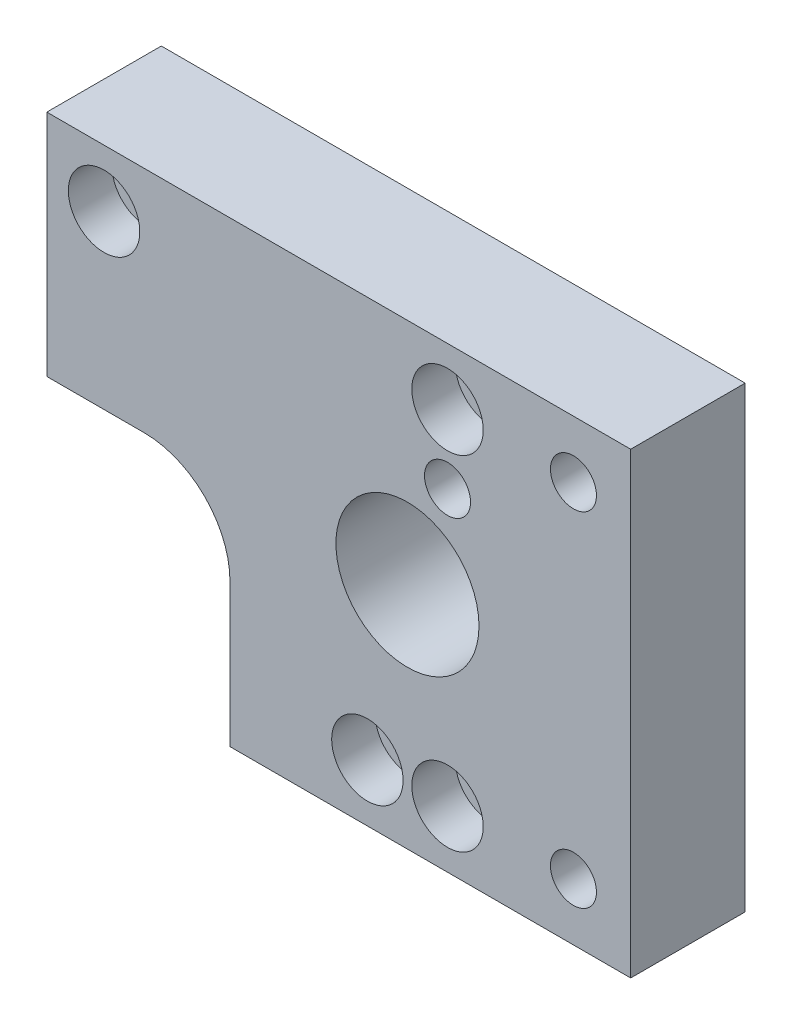
ISO-10303-21;
HEADER;
FILE_DESCRIPTION(('STEP AP214'),'2;1');
FILE_NAME('part.step','',(''),(''),'','','');
FILE_SCHEMA(('AUTOMOTIVE_DESIGN { 1 0 10303 214 1 1 1 1 }'));
ENDSEC;
DATA;
#1=APPLICATION_CONTEXT('core data for automotive mechanical design processes');
#2=APPLICATION_PROTOCOL_DEFINITION('international standard','automotive_design',2000,#1);
#3=PRODUCT_CONTEXT('',#1,'mechanical');
#4=PRODUCT('Part','Part','',(#3));
#5=PRODUCT_RELATED_PRODUCT_CATEGORY('part','',(#4));
#6=PRODUCT_DEFINITION_FORMATION('','',#4);
#7=PRODUCT_DEFINITION_CONTEXT('part definition',#1,'design');
#8=PRODUCT_DEFINITION('design','',#6,#7);
#9=PRODUCT_DEFINITION_SHAPE('','',#8);
#10=(LENGTH_UNIT() NAMED_UNIT(*) SI_UNIT(.MILLI.,.METRE.));
#11=(NAMED_UNIT(*) PLANE_ANGLE_UNIT() SI_UNIT($,.RADIAN.));
#12=(NAMED_UNIT(*) SI_UNIT($,.STERADIAN.) SOLID_ANGLE_UNIT());
#13=UNCERTAINTY_MEASURE_WITH_UNIT(LENGTH_MEASURE(1.E-05),#10,'distance_accuracy_value','');
#14=(GEOMETRIC_REPRESENTATION_CONTEXT(3) GLOBAL_UNCERTAINTY_ASSIGNED_CONTEXT((#13)) GLOBAL_UNIT_ASSIGNED_CONTEXT((#10,
#11,#12)) REPRESENTATION_CONTEXT('',''));
#15=CARTESIAN_POINT('',(0.,0.,0.));
#16=DIRECTION('',(0.,0.,1.));
#17=DIRECTION('',(1.,0.,0.));
#18=AXIS2_PLACEMENT_3D('',#15,#16,#17);
#19=CARTESIAN_POINT('',(0.,0.,12.7));
#20=DIRECTION('',(0.,0.,-1.));
#21=DIRECTION('',(-1.,0.,0.));
#22=AXIS2_PLACEMENT_3D('',#19,#20,#21);
#23=PLANE('',#22);
#24=CARTESIAN_POINT('',(19.05,-19.05,12.7));
#25=DIRECTION('',(0.,0.,-1.));
#26=DIRECTION('',(-1.,0.,0.));
#27=AXIS2_PLACEMENT_3D('',#24,#25,#26);
#28=CIRCLE('',#27,3.9624);
#29=CARTESIAN_POINT('',(15.0876,-19.05,12.7));
#30=VERTEX_POINT('',#29);
#31=EDGE_CURVE('E155',#30,#30,#28,.T.);
#32=ORIENTED_EDGE('',*,*,#31,.T.);
#33=EDGE_LOOP('',(#32));
#34=FACE_BOUND('',#33,.T.);
#35=CARTESIAN_POINT('',(19.05,19.05,12.7));
#36=DIRECTION('',(0.,0.,-1.));
#37=DIRECTION('',(-1.,0.,0.));
#38=AXIS2_PLACEMENT_3D('',#35,#36,#37);
#39=CIRCLE('',#38,3.9624);
#40=CARTESIAN_POINT('',(15.0876,19.05,12.7));
#41=VERTEX_POINT('',#40);
#42=EDGE_CURVE('E145',#41,#41,#39,.T.);
#43=ORIENTED_EDGE('',*,*,#42,.T.);
#44=EDGE_LOOP('',(#43));
#45=FACE_BOUND('',#44,.T.);
#46=CARTESIAN_POINT('',(33.02,-19.05,12.7));
#47=DIRECTION('',(0.,0.,-1.));
#48=DIRECTION('',(-1.,0.,0.));
#49=AXIS2_PLACEMENT_3D('',#46,#47,#48);
#50=CIRCLE('',#49,2.55269999999999);
#51=CARTESIAN_POINT('',(30.4673,-19.05,12.7));
#52=VERTEX_POINT('',#51);
#53=EDGE_CURVE('E195',#52,#52,#50,.T.);
#54=ORIENTED_EDGE('',*,*,#53,.T.);
#55=EDGE_LOOP('',(#54));
#56=FACE_BOUND('',#55,.T.);
#57=CARTESIAN_POINT('',(33.02,19.05,12.7));
#58=DIRECTION('',(0.,0.,-1.));
#59=DIRECTION('',(-1.,0.,0.));
#60=AXIS2_PLACEMENT_3D('',#57,#58,#59);
#61=CIRCLE('',#60,2.55269999999999);
#62=CARTESIAN_POINT('',(30.4673,19.05,12.7));
#63=VERTEX_POINT('',#62);
#64=EDGE_CURVE('E201',#63,#63,#61,.T.);
#65=ORIENTED_EDGE('',*,*,#64,.T.);
#66=EDGE_LOOP('',(#65));
#67=FACE_BOUND('',#66,.T.);
#68=CARTESIAN_POINT('',(19.05,11.43,12.7));
#69=DIRECTION('',(0.,0.,-1.));
#70=DIRECTION('',(-1.,0.,0.));
#71=AXIS2_PLACEMENT_3D('',#68,#69,#70);
#72=CIRCLE('',#71,2.55269999999999);
#73=CARTESIAN_POINT('',(16.4973,11.43,12.7));
#74=VERTEX_POINT('',#73);
#75=EDGE_CURVE('E207',#74,#74,#72,.T.);
#76=ORIENTED_EDGE('',*,*,#75,.T.);
#77=EDGE_LOOP('',(#76));
#78=FACE_BOUND('',#77,.T.);
#79=DIRECTION('',(1.,0.,0.));
#80=VECTOR('',#79,1.);
#81=CARTESIAN_POINT('',(-25.4,0.,12.7));
#82=LINE('',#81,#80);
#83=CARTESIAN_POINT('',(-25.4,0.,12.7));
#84=VERTEX_POINT('',#83);
#85=CARTESIAN_POINT('',(-14.605,0.,12.7));
#86=VERTEX_POINT('',#85);
#87=EDGE_CURVE('E88',#84,#86,#82,.T.);
#88=ORIENTED_EDGE('',*,*,#87,.T.);
#89=CARTESIAN_POINT('',(-14.605,-9.525,12.7));
#90=DIRECTION('',(0.,0.,-1.));
#91=DIRECTION('',(-1.,0.,0.));
#92=AXIS2_PLACEMENT_3D('',#89,#90,#91);
#93=CIRCLE('',#92,9.525);
#94=CARTESIAN_POINT('',(-5.08,-9.525,12.7));
#95=VERTEX_POINT('',#94);
#96=EDGE_CURVE('E11',#86,#95,#93,.T.);
#97=ORIENTED_EDGE('',*,*,#96,.T.);
#98=DIRECTION('',(0.,-1.,0.));
#99=VECTOR('',#98,1.);
#100=CARTESIAN_POINT('',(-5.08,-25.4,12.7));
#101=LINE('',#100,#99);
#102=CARTESIAN_POINT('',(-5.08,-25.4,12.7));
#103=VERTEX_POINT('',#102);
#104=EDGE_CURVE('E95',#95,#103,#101,.T.);
#105=ORIENTED_EDGE('',*,*,#104,.T.);
#106=DIRECTION('',(1.,0.,0.));
#107=VECTOR('',#106,1.);
#108=CARTESIAN_POINT('',(-25.4,-25.4,12.7));
#109=LINE('',#108,#107);
#110=CARTESIAN_POINT('',(39.37,-25.4,12.7));
#111=VERTEX_POINT('',#110);
#112=EDGE_CURVE('E112',#103,#111,#109,.T.);
#113=ORIENTED_EDGE('',*,*,#112,.T.);
#114=DIRECTION('',(0.,1.,0.));
#115=VECTOR('',#114,1.);
#116=CARTESIAN_POINT('',(39.37,-25.4,12.7));
#117=LINE('',#116,#115);
#118=CARTESIAN_POINT('',(39.37,25.4,12.7));
#119=VERTEX_POINT('',#118);
#120=EDGE_CURVE('E116',#111,#119,#117,.T.);
#121=ORIENTED_EDGE('',*,*,#120,.T.);
#122=DIRECTION('',(-1.,0.,0.));
#123=VECTOR('',#122,1.);
#124=CARTESIAN_POINT('',(-25.4,25.4,12.7));
#125=LINE('',#124,#123);
#126=CARTESIAN_POINT('',(-25.4,25.4,12.7));
#127=VERTEX_POINT('',#126);
#128=EDGE_CURVE('E110',#119,#127,#125,.T.);
#129=ORIENTED_EDGE('',*,*,#128,.T.);
#130=DIRECTION('',(0.,-1.,0.));
#131=VECTOR('',#130,1.);
#132=CARTESIAN_POINT('',(-25.4,-25.4,12.7));
#133=LINE('',#132,#131);
#134=EDGE_CURVE('E103',#127,#84,#133,.T.);
#135=ORIENTED_EDGE('',*,*,#134,.T.);
#136=EDGE_LOOP('',(#88,#97,#105,#113,#121,#129,#135));
#137=FACE_BOUND('',#136,.T.);
#138=CARTESIAN_POINT('',(14.605,0.,12.7));
#139=DIRECTION('',(0.,0.,1.));
#140=DIRECTION('',(1.,0.,0.));
#141=AXIS2_PLACEMENT_3D('',#138,#139,#140);
#142=CIRCLE('',#141,7.9375);
#143=CARTESIAN_POINT('',(22.5425,0.,12.7));
#144=VERTEX_POINT('',#143);
#145=EDGE_CURVE('E211',#144,#144,#142,.T.);
#146=ORIENTED_EDGE('',*,*,#145,.F.);
#147=EDGE_LOOP('',(#146));
#148=FACE_BOUND('',#147,.T.);
#149=CARTESIAN_POINT('',(10.16,-19.05,12.7));
#150=DIRECTION('',(0.,0.,-1.));
#151=DIRECTION('',(-1.,0.,0.));
#152=AXIS2_PLACEMENT_3D('',#149,#150,#151);
#153=CIRCLE('',#152,3.9624);
#154=CARTESIAN_POINT('',(6.1976,-19.05,12.7));
#155=VERTEX_POINT('',#154);
#156=EDGE_CURVE('E150',#155,#155,#153,.T.);
#157=ORIENTED_EDGE('',*,*,#156,.T.);
#158=EDGE_LOOP('',(#157));
#159=FACE_BOUND('',#158,.T.);
#160=CARTESIAN_POINT('',(-19.05,19.05,12.7));
#161=DIRECTION('',(0.,0.,-1.));
#162=DIRECTION('',(-1.,0.,0.));
#163=AXIS2_PLACEMENT_3D('',#160,#161,#162);
#164=CIRCLE('',#163,3.9624);
#165=CARTESIAN_POINT('',(-23.0124,19.05,12.7));
#166=VERTEX_POINT('',#165);
#167=EDGE_CURVE('E175',#166,#166,#164,.T.);
#168=ORIENTED_EDGE('',*,*,#167,.T.);
#169=EDGE_LOOP('',(#168));
#170=FACE_BOUND('',#169,.T.);
#171=ADVANCED_FACE('F33',(#34,#45,#56,#67,#78,#137,#148,#159,#170),#23,.F.);
#172=CARTESIAN_POINT('',(0.,0.,0.));
#173=DIRECTION('',(0.,0.,-1.));
#174=DIRECTION('',(-1.,0.,0.));
#175=AXIS2_PLACEMENT_3D('',#172,#173,#174);
#176=PLANE('',#175);
#177=DIRECTION('',(0.,-1.,0.));
#178=VECTOR('',#177,1.);
#179=CARTESIAN_POINT('',(-5.08,-25.4,0.));
#180=LINE('',#179,#178);
#181=CARTESIAN_POINT('',(-5.08,-9.525,0.));
#182=VERTEX_POINT('',#181);
#183=CARTESIAN_POINT('',(-5.08,-25.4,0.));
#184=VERTEX_POINT('',#183);
#185=EDGE_CURVE('E96',#182,#184,#180,.T.);
#186=ORIENTED_EDGE('',*,*,#185,.F.);
#187=CARTESIAN_POINT('',(-14.605,-9.525,0.));
#188=DIRECTION('',(0.,0.,-1.));
#189=DIRECTION('',(-1.,0.,0.));
#190=AXIS2_PLACEMENT_3D('',#187,#188,#189);
#191=CIRCLE('',#190,9.525);
#192=CARTESIAN_POINT('',(-14.605,0.,0.));
#193=VERTEX_POINT('',#192);
#194=EDGE_CURVE('E41',#182,#193,#191,.F.);
#195=ORIENTED_EDGE('',*,*,#194,.T.);
#196=DIRECTION('',(1.,0.,0.));
#197=VECTOR('',#196,1.);
#198=CARTESIAN_POINT('',(-25.4,0.,0.));
#199=LINE('',#198,#197);
#200=CARTESIAN_POINT('',(-25.4,0.,0.));
#201=VERTEX_POINT('',#200);
#202=EDGE_CURVE('E170',#201,#193,#199,.T.);
#203=ORIENTED_EDGE('',*,*,#202,.F.);
#204=DIRECTION('',(0.,-1.,0.));
#205=VECTOR('',#204,1.);
#206=CARTESIAN_POINT('',(-25.4,-25.4,0.));
#207=LINE('',#206,#205);
#208=CARTESIAN_POINT('',(-25.4,25.4,0.));
#209=VERTEX_POINT('',#208);
#210=EDGE_CURVE('E105',#209,#201,#207,.T.);
#211=ORIENTED_EDGE('',*,*,#210,.F.);
#212=DIRECTION('',(-1.,0.,0.));
#213=VECTOR('',#212,1.);
#214=CARTESIAN_POINT('',(-25.4,25.4,0.));
#215=LINE('',#214,#213);
#216=CARTESIAN_POINT('',(39.37,25.4,0.));
#217=VERTEX_POINT('',#216);
#218=EDGE_CURVE('E123',#217,#209,#215,.T.);
#219=ORIENTED_EDGE('',*,*,#218,.F.);
#220=DIRECTION('',(0.,1.,0.));
#221=VECTOR('',#220,1.);
#222=CARTESIAN_POINT('',(39.37,-25.4,0.));
#223=LINE('',#222,#221);
#224=CARTESIAN_POINT('',(39.37,-25.4,0.));
#225=VERTEX_POINT('',#224);
#226=EDGE_CURVE('E120',#225,#217,#223,.T.);
#227=ORIENTED_EDGE('',*,*,#226,.F.);
#228=DIRECTION('',(1.,0.,0.));
#229=VECTOR('',#228,1.);
#230=CARTESIAN_POINT('',(-25.4,-25.4,0.));
#231=LINE('',#230,#229);
#232=EDGE_CURVE('E127',#184,#225,#231,.T.);
#233=ORIENTED_EDGE('',*,*,#232,.F.);
#234=EDGE_LOOP('',(#186,#195,#203,#211,#219,#227,#233));
#235=FACE_BOUND('',#234,.T.);
#236=CARTESIAN_POINT('',(33.02,-19.05,0.));
#237=DIRECTION('',(0.,0.,-1.));
#238=DIRECTION('',(-1.,0.,0.));
#239=AXIS2_PLACEMENT_3D('',#236,#237,#238);
#240=CIRCLE('',#239,2.55269999999999);
#241=CARTESIAN_POINT('',(30.4673,-19.05,0.));
#242=VERTEX_POINT('',#241);
#243=EDGE_CURVE('E140',#242,#242,#240,.T.);
#244=ORIENTED_EDGE('',*,*,#243,.F.);
#245=EDGE_LOOP('',(#244));
#246=FACE_BOUND('',#245,.T.);
#247=CARTESIAN_POINT('',(33.02,19.05,0.));
#248=DIRECTION('',(0.,0.,-1.));
#249=DIRECTION('',(-1.,0.,0.));
#250=AXIS2_PLACEMENT_3D('',#247,#248,#249);
#251=CIRCLE('',#250,2.55269999999999);
#252=CARTESIAN_POINT('',(30.4673,19.05,0.));
#253=VERTEX_POINT('',#252);
#254=EDGE_CURVE('E198',#253,#253,#251,.T.);
#255=ORIENTED_EDGE('',*,*,#254,.F.);
#256=EDGE_LOOP('',(#255));
#257=FACE_BOUND('',#256,.T.);
#258=CARTESIAN_POINT('',(19.05,11.43,0.));
#259=DIRECTION('',(0.,0.,-1.));
#260=DIRECTION('',(-1.,0.,0.));
#261=AXIS2_PLACEMENT_3D('',#258,#259,#260);
#262=CIRCLE('',#261,2.55269999999999);
#263=CARTESIAN_POINT('',(16.4973,11.43,0.));
#264=VERTEX_POINT('',#263);
#265=EDGE_CURVE('E204',#264,#264,#262,.T.);
#266=ORIENTED_EDGE('',*,*,#265,.F.);
#267=EDGE_LOOP('',(#266));
#268=FACE_BOUND('',#267,.T.);
#269=CARTESIAN_POINT('',(10.16,-19.05,0.));
#270=DIRECTION('',(0.,0.,1.));
#271=DIRECTION('',(1.,0.,0.));
#272=AXIS2_PLACEMENT_3D('',#269,#270,#271);
#273=CIRCLE('',#272,2.5527);
#274=CARTESIAN_POINT('',(12.7127,-19.05,0.));
#275=VERTEX_POINT('',#274);
#276=EDGE_CURVE('E214',#275,#275,#273,.T.);
#277=ORIENTED_EDGE('',*,*,#276,.T.);
#278=EDGE_LOOP('',(#277));
#279=FACE_BOUND('',#278,.T.);
#280=CARTESIAN_POINT('',(19.05,19.05,0.));
#281=DIRECTION('',(0.,0.,1.));
#282=DIRECTION('',(1.,0.,0.));
#283=AXIS2_PLACEMENT_3D('',#280,#281,#282);
#284=CIRCLE('',#283,2.55269999999999);
#285=CARTESIAN_POINT('',(21.6027,19.05,0.));
#286=VERTEX_POINT('',#285);
#287=EDGE_CURVE('E222',#286,#286,#284,.T.);
#288=ORIENTED_EDGE('',*,*,#287,.T.);
#289=EDGE_LOOP('',(#288));
#290=FACE_BOUND('',#289,.T.);
#291=CARTESIAN_POINT('',(-19.05,19.05,0.));
#292=DIRECTION('',(0.,0.,1.));
#293=DIRECTION('',(-1.,0.,0.));
#294=AXIS2_PLACEMENT_3D('',#291,#292,#293);
#295=CIRCLE('',#294,2.55269999999999);
#296=CARTESIAN_POINT('',(-21.6027,19.05,0.));
#297=VERTEX_POINT('',#296);
#298=EDGE_CURVE('E124',#297,#297,#295,.T.);
#299=ORIENTED_EDGE('',*,*,#298,.T.);
#300=EDGE_LOOP('',(#299));
#301=FACE_BOUND('',#300,.T.);
#302=CARTESIAN_POINT('',(19.05,-19.05,0.));
#303=DIRECTION('',(0.,0.,1.));
#304=DIRECTION('',(1.,0.,0.));
#305=AXIS2_PLACEMENT_3D('',#302,#303,#304);
#306=CIRCLE('',#305,2.5527);
#307=CARTESIAN_POINT('',(21.6027,-19.05,0.));
#308=VERTEX_POINT('',#307);
#309=EDGE_CURVE('E219',#308,#308,#306,.T.);
#310=ORIENTED_EDGE('',*,*,#309,.T.);
#311=EDGE_LOOP('',(#310));
#312=FACE_BOUND('',#311,.T.);
#313=CARTESIAN_POINT('',(14.605,0.,0.));
#314=DIRECTION('',(0.,0.,1.));
#315=DIRECTION('',(1.,0.,0.));
#316=AXIS2_PLACEMENT_3D('',#313,#314,#315);
#317=CIRCLE('',#316,7.9375);
#318=CARTESIAN_POINT('',(22.5425,0.,0.));
#319=VERTEX_POINT('',#318);
#320=EDGE_CURVE('E210',#319,#319,#317,.T.);
#321=ORIENTED_EDGE('',*,*,#320,.T.);
#322=EDGE_LOOP('',(#321));
#323=FACE_BOUND('',#322,.T.);
#324=ADVANCED_FACE('F167',(#235,#246,#257,#268,#279,#290,#301,#312,#323),#176,.T.);
#325=CARTESIAN_POINT('',(39.37,-25.4,12.7));
#326=DIRECTION('',(-1.,0.,0.));
#327=DIRECTION('',(0.,0.,1.));
#328=AXIS2_PLACEMENT_3D('',#325,#326,#327);
#329=PLANE('',#328);
#330=ORIENTED_EDGE('',*,*,#226,.T.);
#331=DIRECTION('',(0.,0.,-1.));
#332=VECTOR('',#331,1.);
#333=CARTESIAN_POINT('',(39.37,25.4,12.7));
#334=LINE('',#333,#332);
#335=EDGE_CURVE('E133',#119,#217,#334,.T.);
#336=ORIENTED_EDGE('',*,*,#335,.F.);
#337=ORIENTED_EDGE('',*,*,#120,.F.);
#338=DIRECTION('',(0.,0.,-1.));
#339=VECTOR('',#338,1.);
#340=CARTESIAN_POINT('',(39.37,-25.4,12.7));
#341=LINE('',#340,#339);
#342=EDGE_CURVE('E114',#111,#225,#341,.T.);
#343=ORIENTED_EDGE('',*,*,#342,.T.);
#344=EDGE_LOOP('',(#330,#336,#337,#343));
#345=FACE_BOUND('',#344,.T.);
#346=ADVANCED_FACE('F231',(#345),#329,.F.);
#347=CARTESIAN_POINT('',(-25.4,25.4,12.7));
#348=DIRECTION('',(0.,-1.,0.));
#349=DIRECTION('',(1.,0.,0.));
#350=AXIS2_PLACEMENT_3D('',#347,#348,#349);
#351=PLANE('',#350);
#352=ORIENTED_EDGE('',*,*,#218,.T.);
#353=DIRECTION('',(0.,0.,-1.));
#354=VECTOR('',#353,1.);
#355=CARTESIAN_POINT('',(-25.4,25.4,12.7));
#356=LINE('',#355,#354);
#357=EDGE_CURVE('E131',#127,#209,#356,.T.);
#358=ORIENTED_EDGE('',*,*,#357,.F.);
#359=ORIENTED_EDGE('',*,*,#128,.F.);
#360=ORIENTED_EDGE('',*,*,#335,.T.);
#361=EDGE_LOOP('',(#352,#358,#359,#360));
#362=FACE_BOUND('',#361,.T.);
#363=ADVANCED_FACE('F233',(#362),#351,.F.);
#364=CARTESIAN_POINT('',(-25.4,-25.4,12.7));
#365=DIRECTION('',(1.,0.,0.));
#366=DIRECTION('',(0.,0.,-1.));
#367=AXIS2_PLACEMENT_3D('',#364,#365,#366);
#368=PLANE('',#367);
#369=ORIENTED_EDGE('',*,*,#210,.T.);
#370=DIRECTION('',(0.,0.,-1.));
#371=VECTOR('',#370,1.);
#372=CARTESIAN_POINT('',(-25.4,0.,12.7));
#373=LINE('',#372,#371);
#374=EDGE_CURVE('E91',#84,#201,#373,.T.);
#375=ORIENTED_EDGE('',*,*,#374,.F.);
#376=ORIENTED_EDGE('',*,*,#134,.F.);
#377=ORIENTED_EDGE('',*,*,#357,.T.);
#378=EDGE_LOOP('',(#369,#375,#376,#377));
#379=FACE_BOUND('',#378,.T.);
#380=ADVANCED_FACE('F101',(#379),#368,.F.);
#381=CARTESIAN_POINT('',(-25.4,-25.4,12.7));
#382=DIRECTION('',(0.,1.,0.));
#383=DIRECTION('',(0.,0.,1.));
#384=AXIS2_PLACEMENT_3D('',#381,#382,#383);
#385=PLANE('',#384);
#386=ORIENTED_EDGE('',*,*,#112,.F.);
#387=DIRECTION('',(0.,0.,-1.));
#388=VECTOR('',#387,1.);
#389=CARTESIAN_POINT('',(-5.08,-25.4,12.7));
#390=LINE('',#389,#388);
#391=EDGE_CURVE('E106',#103,#184,#390,.T.);
#392=ORIENTED_EDGE('',*,*,#391,.T.);
#393=ORIENTED_EDGE('',*,*,#232,.T.);
#394=ORIENTED_EDGE('',*,*,#342,.F.);
#395=EDGE_LOOP('',(#386,#392,#393,#394));
#396=FACE_BOUND('',#395,.T.);
#397=ADVANCED_FACE('F235',(#396),#385,.F.);
#398=CARTESIAN_POINT('',(-19.05,19.05,12.7));
#399=DIRECTION('',(0.,0.,-1.));
#400=DIRECTION('',(-1.,0.,0.));
#401=AXIS2_PLACEMENT_3D('',#398,#399,#400);
#402=CYLINDRICAL_SURFACE('',#401,2.55269999999999);
#403=CARTESIAN_POINT('',(-19.05,19.05,7.874));
#404=DIRECTION('',(0.,0.,-1.));
#405=DIRECTION('',(-1.,0.,0.));
#406=AXIS2_PLACEMENT_3D('',#403,#404,#405);
#407=CIRCLE('',#406,2.55269999999999);
#408=CARTESIAN_POINT('',(-21.6027,19.05,7.874));
#409=VERTEX_POINT('',#408);
#410=EDGE_CURVE('E152',#409,#409,#407,.T.);
#411=ORIENTED_EDGE('',*,*,#410,.F.);
#412=EDGE_LOOP('',(#411));
#413=FACE_BOUND('',#412,.T.);
#414=ORIENTED_EDGE('',*,*,#298,.F.);
#415=EDGE_LOOP('',(#414));
#416=FACE_BOUND('',#415,.T.);
#417=ADVANCED_FACE('F237',(#413,#416),#402,.F.);
#418=CARTESIAN_POINT('',(19.05,19.05,12.7));
#419=DIRECTION('',(0.,0.,-1.));
#420=DIRECTION('',(-1.,0.,0.));
#421=AXIS2_PLACEMENT_3D('',#418,#419,#420);
#422=CYLINDRICAL_SURFACE('',#421,2.55269999999999);
#423=CARTESIAN_POINT('',(19.05,19.05,7.874));
#424=DIRECTION('',(0.,0.,-1.));
#425=DIRECTION('',(-1.,0.,0.));
#426=AXIS2_PLACEMENT_3D('',#423,#424,#425);
#427=CIRCLE('',#426,2.55269999999999);
#428=CARTESIAN_POINT('',(16.4973,19.05,7.874));
#429=VERTEX_POINT('',#428);
#430=EDGE_CURVE('E137',#429,#429,#427,.T.);
#431=ORIENTED_EDGE('',*,*,#430,.F.);
#432=EDGE_LOOP('',(#431));
#433=FACE_BOUND('',#432,.T.);
#434=ORIENTED_EDGE('',*,*,#287,.F.);
#435=EDGE_LOOP('',(#434));
#436=FACE_BOUND('',#435,.T.);
#437=ADVANCED_FACE('F243',(#433,#436),#422,.F.);
#438=CARTESIAN_POINT('',(19.05,-19.05,12.7));
#439=DIRECTION('',(0.,0.,-1.));
#440=DIRECTION('',(-1.,0.,0.));
#441=AXIS2_PLACEMENT_3D('',#438,#439,#440);
#442=CYLINDRICAL_SURFACE('',#441,2.5527);
#443=CARTESIAN_POINT('',(19.05,-19.05,7.874));
#444=DIRECTION('',(0.,0.,-1.));
#445=DIRECTION('',(-1.,0.,0.));
#446=AXIS2_PLACEMENT_3D('',#443,#444,#445);
#447=CIRCLE('',#446,2.5527);
#448=CARTESIAN_POINT('',(16.4973,-19.05,7.874));
#449=VERTEX_POINT('',#448);
#450=EDGE_CURVE('E147',#449,#449,#447,.T.);
#451=ORIENTED_EDGE('',*,*,#450,.F.);
#452=EDGE_LOOP('',(#451));
#453=FACE_BOUND('',#452,.T.);
#454=ORIENTED_EDGE('',*,*,#309,.F.);
#455=EDGE_LOOP('',(#454));
#456=FACE_BOUND('',#455,.T.);
#457=ADVANCED_FACE('F258',(#453,#456),#442,.F.);
#458=CARTESIAN_POINT('',(10.16,-19.05,12.7));
#459=DIRECTION('',(0.,0.,-1.));
#460=DIRECTION('',(-1.,0.,0.));
#461=AXIS2_PLACEMENT_3D('',#458,#459,#460);
#462=CYLINDRICAL_SURFACE('',#461,2.5527);
#463=CARTESIAN_POINT('',(10.16,-19.05,7.874));
#464=DIRECTION('',(0.,0.,-1.));
#465=DIRECTION('',(-1.,0.,0.));
#466=AXIS2_PLACEMENT_3D('',#463,#464,#465);
#467=CIRCLE('',#466,2.5527);
#468=CARTESIAN_POINT('',(7.6073,-19.05,7.874));
#469=VERTEX_POINT('',#468);
#470=EDGE_CURVE('E142',#469,#469,#467,.T.);
#471=ORIENTED_EDGE('',*,*,#470,.F.);
#472=EDGE_LOOP('',(#471));
#473=FACE_BOUND('',#472,.T.);
#474=ORIENTED_EDGE('',*,*,#276,.F.);
#475=EDGE_LOOP('',(#474));
#476=FACE_BOUND('',#475,.T.);
#477=ADVANCED_FACE('F262',(#473,#476),#462,.F.);
#478=CARTESIAN_POINT('',(14.605,0.,12.7));
#479=DIRECTION('',(0.,0.,-1.));
#480=DIRECTION('',(-1.,0.,0.));
#481=AXIS2_PLACEMENT_3D('',#478,#479,#480);
#482=CYLINDRICAL_SURFACE('',#481,7.9375);
#483=ORIENTED_EDGE('',*,*,#145,.T.);
#484=EDGE_LOOP('',(#483));
#485=FACE_BOUND('',#484,.T.);
#486=ORIENTED_EDGE('',*,*,#320,.F.);
#487=EDGE_LOOP('',(#486));
#488=FACE_BOUND('',#487,.T.);
#489=ADVANCED_FACE('F266',(#485,#488),#482,.F.);
#490=CARTESIAN_POINT('',(19.05,11.43,0.));
#491=DIRECTION('',(0.,0.,-1.));
#492=DIRECTION('',(-1.,0.,0.));
#493=AXIS2_PLACEMENT_3D('',#490,#491,#492);
#494=CYLINDRICAL_SURFACE('',#493,2.55269999999999);
#495=ORIENTED_EDGE('',*,*,#265,.T.);
#496=EDGE_LOOP('',(#495));
#497=FACE_BOUND('',#496,.T.);
#498=ORIENTED_EDGE('',*,*,#75,.F.);
#499=EDGE_LOOP('',(#498));
#500=FACE_BOUND('',#499,.T.);
#501=ADVANCED_FACE('F270',(#497,#500),#494,.F.);
#502=CARTESIAN_POINT('',(33.02,19.05,0.));
#503=DIRECTION('',(0.,0.,-1.));
#504=DIRECTION('',(-1.,0.,0.));
#505=AXIS2_PLACEMENT_3D('',#502,#503,#504);
#506=CYLINDRICAL_SURFACE('',#505,2.55269999999999);
#507=ORIENTED_EDGE('',*,*,#254,.T.);
#508=EDGE_LOOP('',(#507));
#509=FACE_BOUND('',#508,.T.);
#510=ORIENTED_EDGE('',*,*,#64,.F.);
#511=EDGE_LOOP('',(#510));
#512=FACE_BOUND('',#511,.T.);
#513=ADVANCED_FACE('F274',(#509,#512),#506,.F.);
#514=CARTESIAN_POINT('',(33.02,-19.05,0.));
#515=DIRECTION('',(0.,0.,-1.));
#516=DIRECTION('',(-1.,0.,0.));
#517=AXIS2_PLACEMENT_3D('',#514,#515,#516);
#518=CYLINDRICAL_SURFACE('',#517,2.55269999999999);
#519=ORIENTED_EDGE('',*,*,#243,.T.);
#520=EDGE_LOOP('',(#519));
#521=FACE_BOUND('',#520,.T.);
#522=ORIENTED_EDGE('',*,*,#53,.F.);
#523=EDGE_LOOP('',(#522));
#524=FACE_BOUND('',#523,.T.);
#525=ADVANCED_FACE('F278',(#521,#524),#518,.F.);
#526=CARTESIAN_POINT('',(19.05,19.05,7.874));
#527=DIRECTION('',(0.,0.,1.));
#528=DIRECTION('',(1.,0.,0.));
#529=AXIS2_PLACEMENT_3D('',#526,#527,#528);
#530=CYLINDRICAL_SURFACE('',#529,3.9624);
#531=CARTESIAN_POINT('',(19.05,19.05,7.874));
#532=DIRECTION('',(0.,0.,-1.));
#533=DIRECTION('',(-1.,0.,0.));
#534=AXIS2_PLACEMENT_3D('',#531,#532,#533);
#535=CIRCLE('',#534,3.9624);
#536=CARTESIAN_POINT('',(15.0876,19.05,7.874));
#537=VERTEX_POINT('',#536);
#538=EDGE_CURVE('E141',#537,#537,#535,.T.);
#539=ORIENTED_EDGE('',*,*,#538,.T.);
#540=EDGE_LOOP('',(#539));
#541=FACE_BOUND('',#540,.T.);
#542=ORIENTED_EDGE('',*,*,#42,.F.);
#543=EDGE_LOOP('',(#542));
#544=FACE_BOUND('',#543,.T.);
#545=ADVANCED_FACE('F282',(#541,#544),#530,.F.);
#546=CARTESIAN_POINT('',(19.05,19.05,7.874));
#547=DIRECTION('',(0.,0.,-1.));
#548=DIRECTION('',(-1.,0.,0.));
#549=AXIS2_PLACEMENT_3D('',#546,#547,#548);
#550=PLANE('',#549);
#551=ORIENTED_EDGE('',*,*,#430,.T.);
#552=EDGE_LOOP('',(#551));
#553=FACE_BOUND('',#552,.T.);
#554=ORIENTED_EDGE('',*,*,#538,.F.);
#555=EDGE_LOOP('',(#554));
#556=FACE_BOUND('',#555,.T.);
#557=ADVANCED_FACE('F286',(#553,#556),#550,.F.);
#558=CARTESIAN_POINT('',(10.16,-19.05,7.874));
#559=DIRECTION('',(0.,0.,1.));
#560=DIRECTION('',(1.,0.,0.));
#561=AXIS2_PLACEMENT_3D('',#558,#559,#560);
#562=CYLINDRICAL_SURFACE('',#561,3.9624);
#563=CARTESIAN_POINT('',(10.16,-19.05,7.874));
#564=DIRECTION('',(0.,0.,-1.));
#565=DIRECTION('',(-1.,0.,0.));
#566=AXIS2_PLACEMENT_3D('',#563,#564,#565);
#567=CIRCLE('',#566,3.9624);
#568=CARTESIAN_POINT('',(6.1976,-19.05,7.874));
#569=VERTEX_POINT('',#568);
#570=EDGE_CURVE('E146',#569,#569,#567,.T.);
#571=ORIENTED_EDGE('',*,*,#570,.T.);
#572=EDGE_LOOP('',(#571));
#573=FACE_BOUND('',#572,.T.);
#574=ORIENTED_EDGE('',*,*,#156,.F.);
#575=EDGE_LOOP('',(#574));
#576=FACE_BOUND('',#575,.T.);
#577=ADVANCED_FACE('F290',(#573,#576),#562,.F.);
#578=CARTESIAN_POINT('',(10.16,-19.05,7.874));
#579=DIRECTION('',(0.,0.,-1.));
#580=DIRECTION('',(-1.,0.,0.));
#581=AXIS2_PLACEMENT_3D('',#578,#579,#580);
#582=PLANE('',#581);
#583=ORIENTED_EDGE('',*,*,#470,.T.);
#584=EDGE_LOOP('',(#583));
#585=FACE_BOUND('',#584,.T.);
#586=ORIENTED_EDGE('',*,*,#570,.F.);
#587=EDGE_LOOP('',(#586));
#588=FACE_BOUND('',#587,.T.);
#589=ADVANCED_FACE('F294',(#585,#588),#582,.F.);
#590=CARTESIAN_POINT('',(19.05,-19.05,7.874));
#591=DIRECTION('',(0.,0.,1.));
#592=DIRECTION('',(1.,0.,0.));
#593=AXIS2_PLACEMENT_3D('',#590,#591,#592);
#594=CYLINDRICAL_SURFACE('',#593,3.9624);
#595=CARTESIAN_POINT('',(19.05,-19.05,7.874));
#596=DIRECTION('',(0.,0.,-1.));
#597=DIRECTION('',(-1.,0.,0.));
#598=AXIS2_PLACEMENT_3D('',#595,#596,#597);
#599=CIRCLE('',#598,3.9624);
#600=CARTESIAN_POINT('',(15.0876,-19.05,7.874));
#601=VERTEX_POINT('',#600);
#602=EDGE_CURVE('E151',#601,#601,#599,.T.);
#603=ORIENTED_EDGE('',*,*,#602,.T.);
#604=EDGE_LOOP('',(#603));
#605=FACE_BOUND('',#604,.T.);
#606=ORIENTED_EDGE('',*,*,#31,.F.);
#607=EDGE_LOOP('',(#606));
#608=FACE_BOUND('',#607,.T.);
#609=ADVANCED_FACE('F298',(#605,#608),#594,.F.);
#610=CARTESIAN_POINT('',(19.05,-19.05,7.874));
#611=DIRECTION('',(0.,0.,-1.));
#612=DIRECTION('',(-1.,0.,0.));
#613=AXIS2_PLACEMENT_3D('',#610,#611,#612);
#614=PLANE('',#613);
#615=ORIENTED_EDGE('',*,*,#450,.T.);
#616=EDGE_LOOP('',(#615));
#617=FACE_BOUND('',#616,.T.);
#618=ORIENTED_EDGE('',*,*,#602,.F.);
#619=EDGE_LOOP('',(#618));
#620=FACE_BOUND('',#619,.T.);
#621=ADVANCED_FACE('F302',(#617,#620),#614,.F.);
#622=CARTESIAN_POINT('',(-19.05,19.05,7.874));
#623=DIRECTION('',(0.,0.,1.));
#624=DIRECTION('',(1.,0.,0.));
#625=AXIS2_PLACEMENT_3D('',#622,#623,#624);
#626=CYLINDRICAL_SURFACE('',#625,3.9624);
#627=CARTESIAN_POINT('',(-19.05,19.05,7.874));
#628=DIRECTION('',(0.,0.,-1.));
#629=DIRECTION('',(-1.,0.,0.));
#630=AXIS2_PLACEMENT_3D('',#627,#628,#629);
#631=CIRCLE('',#630,3.9624);
#632=CARTESIAN_POINT('',(-23.0124,19.05,7.874));
#633=VERTEX_POINT('',#632);
#634=EDGE_CURVE('E156',#633,#633,#631,.T.);
#635=ORIENTED_EDGE('',*,*,#634,.T.);
#636=EDGE_LOOP('',(#635));
#637=FACE_BOUND('',#636,.T.);
#638=ORIENTED_EDGE('',*,*,#167,.F.);
#639=EDGE_LOOP('',(#638));
#640=FACE_BOUND('',#639,.T.);
#641=ADVANCED_FACE('F306',(#637,#640),#626,.F.);
#642=CARTESIAN_POINT('',(-19.05,19.05,7.874));
#643=DIRECTION('',(0.,0.,-1.));
#644=DIRECTION('',(-1.,0.,0.));
#645=AXIS2_PLACEMENT_3D('',#642,#643,#644);
#646=PLANE('',#645);
#647=ORIENTED_EDGE('',*,*,#410,.T.);
#648=EDGE_LOOP('',(#647));
#649=FACE_BOUND('',#648,.T.);
#650=ORIENTED_EDGE('',*,*,#634,.F.);
#651=EDGE_LOOP('',(#650));
#652=FACE_BOUND('',#651,.T.);
#653=ADVANCED_FACE('F310',(#649,#652),#646,.F.);
#654=CARTESIAN_POINT('',(-5.08,-25.4,12.7));
#655=DIRECTION('',(1.,0.,0.));
#656=DIRECTION('',(0.,0.,-1.));
#657=AXIS2_PLACEMENT_3D('',#654,#655,#656);
#658=PLANE('',#657);
#659=ORIENTED_EDGE('',*,*,#104,.F.);
#660=DIRECTION('',(0.,0.,-1.));
#661=VECTOR('',#660,1.);
#662=CARTESIAN_POINT('',(-5.08,-9.525,0.));
#663=LINE('',#662,#661);
#664=EDGE_CURVE('E136',#95,#182,#663,.T.);
#665=ORIENTED_EDGE('',*,*,#664,.T.);
#666=ORIENTED_EDGE('',*,*,#185,.T.);
#667=ORIENTED_EDGE('',*,*,#391,.F.);
#668=EDGE_LOOP('',(#659,#665,#666,#667));
#669=FACE_BOUND('',#668,.T.);
#670=ADVANCED_FACE('F162',(#669),#658,.F.);
#671=CARTESIAN_POINT('',(-25.4,0.,12.7));
#672=DIRECTION('',(0.,1.,0.));
#673=DIRECTION('',(-1.,0.,0.));
#674=AXIS2_PLACEMENT_3D('',#671,#672,#673);
#675=PLANE('',#674);
#676=ORIENTED_EDGE('',*,*,#202,.T.);
#677=DIRECTION('',(0.,0.,-1.));
#678=VECTOR('',#677,1.);
#679=CARTESIAN_POINT('',(-14.605,0.,12.7));
#680=LINE('',#679,#678);
#681=EDGE_CURVE('E48',#193,#86,#680,.F.);
#682=ORIENTED_EDGE('',*,*,#681,.T.);
#683=ORIENTED_EDGE('',*,*,#87,.F.);
#684=ORIENTED_EDGE('',*,*,#374,.T.);
#685=EDGE_LOOP('',(#676,#682,#683,#684));
#686=FACE_BOUND('',#685,.T.);
#687=ADVANCED_FACE('F90',(#686),#675,.F.);
#688=CARTESIAN_POINT('',(-14.605,-9.525,12.7));
#689=DIRECTION('',(0.,0.,1.));
#690=DIRECTION('',(1.,0.,0.));
#691=AXIS2_PLACEMENT_3D('',#688,#689,#690);
#692=CYLINDRICAL_SURFACE('',#691,9.525);
#693=ORIENTED_EDGE('',*,*,#96,.F.);
#694=ORIENTED_EDGE('',*,*,#681,.F.);
#695=ORIENTED_EDGE('',*,*,#194,.F.);
#696=ORIENTED_EDGE('',*,*,#664,.F.);
#697=EDGE_LOOP('',(#693,#694,#695,#696));
#698=FACE_BOUND('',#697,.T.);
#699=ADVANCED_FACE('F35',(#698),#692,.F.);
#700=CLOSED_SHELL('',(#171,#324,#346,#363,#380,#397,#417,#437,#457,#477,#489,#501,#513,#525,
#545,#557,#577,#589,#609,#621,#641,#653,#670,#687,#699));
#701=MANIFOLD_SOLID_BREP('B2',#700);
#702=ADVANCED_BREP_SHAPE_REPRESENTATION('',(#18,#701),#14);
#703=SHAPE_DEFINITION_REPRESENTATION(#9,#702);
ENDSEC;
END-ISO-10303-21;
